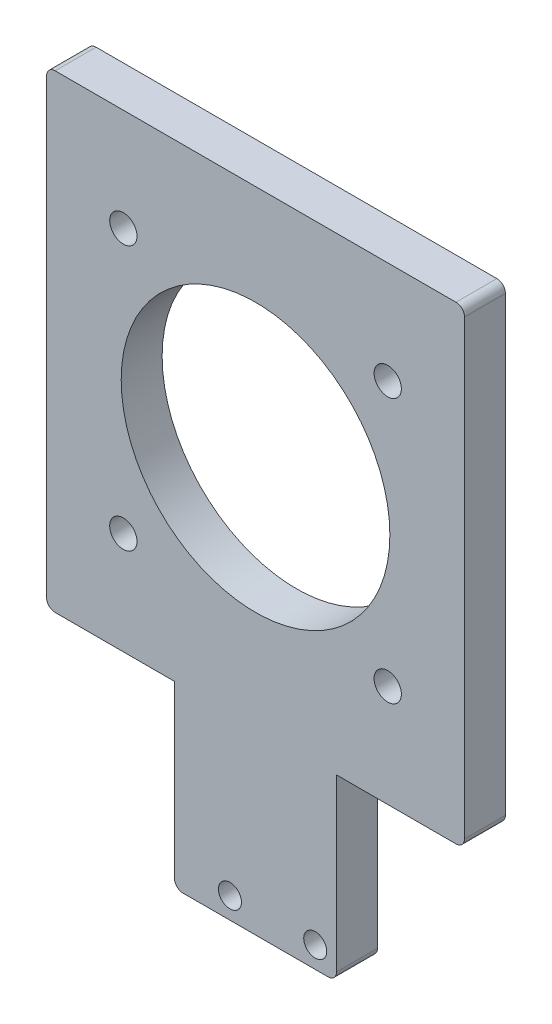
ISO-10303-21;
HEADER;
FILE_DESCRIPTION(('STEP AP214'),'2;1');
FILE_NAME('part.step','',(''),(''),'','','');
FILE_SCHEMA(('AUTOMOTIVE_DESIGN { 1 0 10303 214 1 1 1 1 }'));
ENDSEC;
DATA;
#1=APPLICATION_CONTEXT('core data for automotive mechanical design processes');
#2=APPLICATION_PROTOCOL_DEFINITION('international standard','automotive_design',2000,#1);
#3=PRODUCT_CONTEXT('',#1,'mechanical');
#4=PRODUCT('Part','Part','',(#3));
#5=PRODUCT_RELATED_PRODUCT_CATEGORY('part','',(#4));
#6=PRODUCT_DEFINITION_FORMATION('','',#4);
#7=PRODUCT_DEFINITION_CONTEXT('part definition',#1,'design');
#8=PRODUCT_DEFINITION('design','',#6,#7);
#9=PRODUCT_DEFINITION_SHAPE('','',#8);
#10=(LENGTH_UNIT() NAMED_UNIT(*) SI_UNIT(.MILLI.,.METRE.));
#11=(NAMED_UNIT(*) PLANE_ANGLE_UNIT() SI_UNIT($,.RADIAN.));
#12=(NAMED_UNIT(*) SI_UNIT($,.STERADIAN.) SOLID_ANGLE_UNIT());
#13=UNCERTAINTY_MEASURE_WITH_UNIT(LENGTH_MEASURE(1.E-05),#10,'distance_accuracy_value','');
#14=(GEOMETRIC_REPRESENTATION_CONTEXT(3) GLOBAL_UNCERTAINTY_ASSIGNED_CONTEXT((#13)) GLOBAL_UNIT_ASSIGNED_CONTEXT((#10,
#11,#12)) REPRESENTATION_CONTEXT('',''));
#15=CARTESIAN_POINT('',(0.,0.,0.));
#16=DIRECTION('',(0.,0.,1.));
#17=DIRECTION('',(1.,0.,0.));
#18=AXIS2_PLACEMENT_3D('',#15,#16,#17);
#19=CARTESIAN_POINT('',(13.0004011997071,3.65021960902744,4.8));
#20=DIRECTION('',(0.,0.,-1.));
#21=DIRECTION('',(-1.,0.,0.));
#22=AXIS2_PLACEMENT_3D('',#19,#20,#21);
#23=CYLINDRICAL_SURFACE('',#22,1.);
#24=CARTESIAN_POINT('',(13.0004011997071,3.65021960902744,0.));
#25=DIRECTION('',(0.,0.,-1.));
#26=DIRECTION('',(-1.,0.,0.));
#27=AXIS2_PLACEMENT_3D('',#24,#25,#26);
#28=CIRCLE('',#27,1.);
#29=CARTESIAN_POINT('',(13.0004011997071,2.65021960902744,0.));
#30=VERTEX_POINT('',#29);
#31=CARTESIAN_POINT('',(12.0004011997071,3.65021960902744,0.));
#32=VERTEX_POINT('',#31);
#33=EDGE_CURVE('E165',#30,#32,#28,.T.);
#34=ORIENTED_EDGE('',*,*,#33,.F.);
#35=DIRECTION('',(0.,0.,-1.));
#36=VECTOR('',#35,1.);
#37=CARTESIAN_POINT('',(13.0004011997071,2.65021960902744,4.8));
#38=LINE('',#37,#36);
#39=CARTESIAN_POINT('',(13.0004011997071,2.65021960902744,4.8));
#40=VERTEX_POINT('',#39);
#41=EDGE_CURVE('E11',#40,#30,#38,.T.);
#42=ORIENTED_EDGE('',*,*,#41,.F.);
#43=CARTESIAN_POINT('',(13.0004011997071,3.65021960902744,4.8));
#44=DIRECTION('',(0.,0.,-1.));
#45=DIRECTION('',(-1.,0.,0.));
#46=AXIS2_PLACEMENT_3D('',#43,#44,#45);
#47=CIRCLE('',#46,1.);
#48=CARTESIAN_POINT('',(12.0004011997071,3.65021960902744,4.8));
#49=VERTEX_POINT('',#48);
#50=EDGE_CURVE('E204',#40,#49,#47,.T.);
#51=ORIENTED_EDGE('',*,*,#50,.T.);
#52=DIRECTION('',(0.,0.,-1.));
#53=VECTOR('',#52,1.);
#54=CARTESIAN_POINT('',(12.0004011997071,3.65021960902744,4.8));
#55=LINE('',#54,#53);
#56=EDGE_CURVE('E35',#49,#32,#55,.T.);
#57=ORIENTED_EDGE('',*,*,#56,.T.);
#58=EDGE_LOOP('',(#34,#42,#51,#57));
#59=FACE_BOUND('',#58,.T.);
#60=ADVANCED_FACE('F32',(#59),#23,.T.);
#61=CARTESIAN_POINT('',(27.0004011997071,2.65021960902744,4.8));
#62=DIRECTION('',(0.,-1.,0.));
#63=DIRECTION('',(0.,0.,-1.));
#64=AXIS2_PLACEMENT_3D('',#61,#62,#63);
#65=PLANE('',#64);
#66=DIRECTION('',(-1.,0.,0.));
#67=VECTOR('',#66,1.);
#68=CARTESIAN_POINT('',(27.0004011997071,2.65021960902744,0.));
#69=LINE('',#68,#67);
#70=CARTESIAN_POINT('',(27.0004011997071,2.65021960902744,0.));
#71=VERTEX_POINT('',#70);
#72=EDGE_CURVE('E202',#71,#30,#69,.T.);
#73=ORIENTED_EDGE('',*,*,#72,.F.);
#74=DIRECTION('',(0.,0.,-1.));
#75=VECTOR('',#74,1.);
#76=CARTESIAN_POINT('',(27.0004011997071,2.65021960902744,4.8));
#77=LINE('',#76,#75);
#78=CARTESIAN_POINT('',(27.0004011997071,2.65021960902744,4.8));
#79=VERTEX_POINT('',#78);
#80=EDGE_CURVE('E41',#79,#71,#77,.T.);
#81=ORIENTED_EDGE('',*,*,#80,.F.);
#82=DIRECTION('',(-1.,0.,0.));
#83=VECTOR('',#82,1.);
#84=CARTESIAN_POINT('',(27.0004011997071,2.65021960902744,4.8));
#85=LINE('',#84,#83);
#86=EDGE_CURVE('E155',#79,#40,#85,.T.);
#87=ORIENTED_EDGE('',*,*,#86,.T.);
#88=ORIENTED_EDGE('',*,*,#41,.T.);
#89=EDGE_LOOP('',(#73,#81,#87,#88));
#90=FACE_BOUND('',#89,.T.);
#91=ADVANCED_FACE('F228',(#90),#65,.T.);
#92=CARTESIAN_POINT('',(27.0004011997071,-17.3497803909726,4.8));
#93=DIRECTION('',(-1.,0.,0.));
#94=DIRECTION('',(0.,-1.,0.));
#95=AXIS2_PLACEMENT_3D('',#92,#93,#94);
#96=PLANE('',#95);
#97=DIRECTION('',(0.,1.,0.));
#98=VECTOR('',#97,1.);
#99=CARTESIAN_POINT('',(27.0004011997071,-17.3497803909726,0.));
#100=LINE('',#99,#98);
#101=CARTESIAN_POINT('',(27.0004011997071,-17.3497803909726,0.));
#102=VERTEX_POINT('',#101);
#103=EDGE_CURVE('E142',#102,#71,#100,.T.);
#104=ORIENTED_EDGE('',*,*,#103,.F.);
#105=DIRECTION('',(0.,0.,-1.));
#106=VECTOR('',#105,1.);
#107=CARTESIAN_POINT('',(27.0004011997071,-17.3497803909726,4.8));
#108=LINE('',#107,#106);
#109=CARTESIAN_POINT('',(27.0004011997071,-17.3497803909726,4.8));
#110=VERTEX_POINT('',#109);
#111=EDGE_CURVE('E137',#110,#102,#108,.T.);
#112=ORIENTED_EDGE('',*,*,#111,.F.);
#113=DIRECTION('',(0.,1.,0.));
#114=VECTOR('',#113,1.);
#115=CARTESIAN_POINT('',(27.0004011997071,-17.3497803909726,4.8));
#116=LINE('',#115,#114);
#117=EDGE_CURVE('E140',#110,#79,#116,.T.);
#118=ORIENTED_EDGE('',*,*,#117,.T.);
#119=ORIENTED_EDGE('',*,*,#80,.T.);
#120=EDGE_LOOP('',(#104,#112,#118,#119));
#121=FACE_BOUND('',#120,.T.);
#122=ADVANCED_FACE('F139',(#121),#96,.T.);
#123=CARTESIAN_POINT('',(28.0004011997071,-17.3497803909726,4.8));
#124=DIRECTION('',(0.,0.,-1.));
#125=DIRECTION('',(-1.,0.,0.));
#126=AXIS2_PLACEMENT_3D('',#123,#124,#125);
#127=CYLINDRICAL_SURFACE('',#126,1.);
#128=CARTESIAN_POINT('',(28.0004011997071,-17.3497803909726,0.));
#129=DIRECTION('',(0.,0.,-1.));
#130=DIRECTION('',(-1.,0.,0.));
#131=AXIS2_PLACEMENT_3D('',#128,#129,#130);
#132=CIRCLE('',#131,1.);
#133=CARTESIAN_POINT('',(28.0004011997071,-18.3497803909726,0.));
#134=VERTEX_POINT('',#133);
#135=EDGE_CURVE('E199',#134,#102,#132,.T.);
#136=ORIENTED_EDGE('',*,*,#135,.F.);
#137=DIRECTION('',(0.,0.,-1.));
#138=VECTOR('',#137,1.);
#139=CARTESIAN_POINT('',(28.0004011997071,-18.3497803909726,4.8));
#140=LINE('',#139,#138);
#141=CARTESIAN_POINT('',(28.0004011997071,-18.3497803909726,4.8));
#142=VERTEX_POINT('',#141);
#143=EDGE_CURVE('E147',#142,#134,#140,.T.);
#144=ORIENTED_EDGE('',*,*,#143,.F.);
#145=CARTESIAN_POINT('',(28.0004011997071,-17.3497803909726,4.8));
#146=DIRECTION('',(0.,0.,-1.));
#147=DIRECTION('',(-1.,0.,0.));
#148=AXIS2_PLACEMENT_3D('',#145,#146,#147);
#149=CIRCLE('',#148,1.);
#150=EDGE_CURVE('E153',#142,#110,#149,.T.);
#151=ORIENTED_EDGE('',*,*,#150,.T.);
#152=ORIENTED_EDGE('',*,*,#111,.T.);
#153=EDGE_LOOP('',(#136,#144,#151,#152));
#154=FACE_BOUND('',#153,.T.);
#155=ADVANCED_FACE('F157',(#154),#127,.T.);
#156=CARTESIAN_POINT('',(45.0004011997071,-18.3497803909726,4.8));
#157=DIRECTION('',(0.,-1.,0.));
#158=DIRECTION('',(1.,0.,0.));
#159=AXIS2_PLACEMENT_3D('',#156,#157,#158);
#160=PLANE('',#159);
#161=DIRECTION('',(-1.,0.,0.));
#162=VECTOR('',#161,1.);
#163=CARTESIAN_POINT('',(45.0004011997071,-18.3497803909726,0.));
#164=LINE('',#163,#162);
#165=CARTESIAN_POINT('',(45.0004011997071,-18.3497803909726,0.));
#166=VERTEX_POINT('',#165);
#167=EDGE_CURVE('E196',#166,#134,#164,.T.);
#168=ORIENTED_EDGE('',*,*,#167,.F.);
#169=DIRECTION('',(0.,0.,-1.));
#170=VECTOR('',#169,1.);
#171=CARTESIAN_POINT('',(45.0004011997071,-18.3497803909726,4.8));
#172=LINE('',#171,#170);
#173=CARTESIAN_POINT('',(45.0004011997071,-18.3497803909726,4.8));
#174=VERTEX_POINT('',#173);
#175=EDGE_CURVE('E208',#174,#166,#172,.T.);
#176=ORIENTED_EDGE('',*,*,#175,.F.);
#177=DIRECTION('',(-1.,0.,0.));
#178=VECTOR('',#177,1.);
#179=CARTESIAN_POINT('',(45.0004011997071,-18.3497803909726,4.8));
#180=LINE('',#179,#178);
#181=EDGE_CURVE('E158',#174,#142,#180,.T.);
#182=ORIENTED_EDGE('',*,*,#181,.T.);
#183=ORIENTED_EDGE('',*,*,#143,.T.);
#184=EDGE_LOOP('',(#168,#176,#182,#183));
#185=FACE_BOUND('',#184,.T.);
#186=ADVANCED_FACE('F241',(#185),#160,.T.);
#187=CARTESIAN_POINT('',(45.0004011997071,-17.3497803909726,4.8));
#188=DIRECTION('',(0.,0.,-1.));
#189=DIRECTION('',(-1.,0.,0.));
#190=AXIS2_PLACEMENT_3D('',#187,#188,#189);
#191=CYLINDRICAL_SURFACE('',#190,0.999999999999999);
#192=CARTESIAN_POINT('',(45.0004011997071,-17.3497803909726,0.));
#193=DIRECTION('',(0.,0.,-1.));
#194=DIRECTION('',(-1.,0.,0.));
#195=AXIS2_PLACEMENT_3D('',#192,#193,#194);
#196=CIRCLE('',#195,0.999999999999999);
#197=CARTESIAN_POINT('',(46.0004011997071,-17.3497803909726,0.));
#198=VERTEX_POINT('',#197);
#199=EDGE_CURVE('E193',#198,#166,#196,.T.);
#200=ORIENTED_EDGE('',*,*,#199,.F.);
#201=DIRECTION('',(0.,0.,-1.));
#202=VECTOR('',#201,1.);
#203=CARTESIAN_POINT('',(46.0004011997071,-17.3497803909726,4.8));
#204=LINE('',#203,#202);
#205=CARTESIAN_POINT('',(46.0004011997071,-17.3497803909726,4.8));
#206=VERTEX_POINT('',#205);
#207=EDGE_CURVE('E210',#206,#198,#204,.T.);
#208=ORIENTED_EDGE('',*,*,#207,.F.);
#209=CARTESIAN_POINT('',(45.0004011997071,-17.3497803909726,4.8));
#210=DIRECTION('',(0.,0.,-1.));
#211=DIRECTION('',(-1.,0.,0.));
#212=AXIS2_PLACEMENT_3D('',#209,#210,#211);
#213=CIRCLE('',#212,0.999999999999999);
#214=EDGE_CURVE('E160',#206,#174,#213,.T.);
#215=ORIENTED_EDGE('',*,*,#214,.T.);
#216=ORIENTED_EDGE('',*,*,#175,.T.);
#217=EDGE_LOOP('',(#200,#208,#215,#216));
#218=FACE_BOUND('',#217,.T.);
#219=ADVANCED_FACE('F244',(#218),#191,.T.);
#220=CARTESIAN_POINT('',(46.0004011997071,2.65021960902744,4.8));
#221=DIRECTION('',(1.,0.,0.));
#222=DIRECTION('',(0.,1.,0.));
#223=AXIS2_PLACEMENT_3D('',#220,#221,#222);
#224=PLANE('',#223);
#225=DIRECTION('',(0.,-1.,0.));
#226=VECTOR('',#225,1.);
#227=CARTESIAN_POINT('',(46.0004011997071,2.65021960902744,0.));
#228=LINE('',#227,#226);
#229=CARTESIAN_POINT('',(46.0004011997071,2.65021960902744,0.));
#230=VERTEX_POINT('',#229);
#231=EDGE_CURVE('E190',#230,#198,#228,.T.);
#232=ORIENTED_EDGE('',*,*,#231,.F.);
#233=DIRECTION('',(0.,0.,-1.));
#234=VECTOR('',#233,1.);
#235=CARTESIAN_POINT('',(46.0004011997071,2.65021960902744,4.8));
#236=LINE('',#235,#234);
#237=CARTESIAN_POINT('',(46.0004011997071,2.65021960902744,4.8));
#238=VERTEX_POINT('',#237);
#239=EDGE_CURVE('E212',#238,#230,#236,.T.);
#240=ORIENTED_EDGE('',*,*,#239,.F.);
#241=DIRECTION('',(0.,-1.,0.));
#242=VECTOR('',#241,1.);
#243=CARTESIAN_POINT('',(46.0004011997071,2.65021960902744,4.8));
#244=LINE('',#243,#242);
#245=EDGE_CURVE('E382',#238,#206,#244,.T.);
#246=ORIENTED_EDGE('',*,*,#245,.T.);
#247=ORIENTED_EDGE('',*,*,#207,.T.);
#248=EDGE_LOOP('',(#232,#240,#246,#247));
#249=FACE_BOUND('',#248,.T.);
#250=ADVANCED_FACE('F248',(#249),#224,.T.);
#251=CARTESIAN_POINT('',(60.0004011997071,2.65021960902744,4.8));
#252=DIRECTION('',(0.,-1.,0.));
#253=DIRECTION('',(0.,0.,-1.));
#254=AXIS2_PLACEMENT_3D('',#251,#252,#253);
#255=PLANE('',#254);
#256=DIRECTION('',(-1.,0.,0.));
#257=VECTOR('',#256,1.);
#258=CARTESIAN_POINT('',(60.0004011997071,2.65021960902744,0.));
#259=LINE('',#258,#257);
#260=CARTESIAN_POINT('',(60.0004011997071,2.65021960902743,0.));
#261=VERTEX_POINT('',#260);
#262=EDGE_CURVE('E187',#261,#230,#259,.T.);
#263=ORIENTED_EDGE('',*,*,#262,.F.);
#264=DIRECTION('',(0.,0.,-1.));
#265=VECTOR('',#264,1.);
#266=CARTESIAN_POINT('',(60.0004011997071,2.65021960902743,4.8));
#267=LINE('',#266,#265);
#268=CARTESIAN_POINT('',(60.0004011997071,2.65021960902743,4.8));
#269=VERTEX_POINT('',#268);
#270=EDGE_CURVE('E214',#269,#261,#267,.T.);
#271=ORIENTED_EDGE('',*,*,#270,.F.);
#272=DIRECTION('',(-1.,0.,0.));
#273=VECTOR('',#272,1.);
#274=CARTESIAN_POINT('',(60.0004011997071,2.65021960902744,4.8));
#275=LINE('',#274,#273);
#276=EDGE_CURVE('E379',#269,#238,#275,.T.);
#277=ORIENTED_EDGE('',*,*,#276,.T.);
#278=ORIENTED_EDGE('',*,*,#239,.T.);
#279=EDGE_LOOP('',(#263,#271,#277,#278));
#280=FACE_BOUND('',#279,.T.);
#281=ADVANCED_FACE('F252',(#280),#255,.T.);
#282=CARTESIAN_POINT('',(60.0004011997071,3.65021960902744,4.8));
#283=DIRECTION('',(0.,0.,-1.));
#284=DIRECTION('',(-1.,0.,0.));
#285=AXIS2_PLACEMENT_3D('',#282,#283,#284);
#286=CYLINDRICAL_SURFACE('',#285,1.);
#287=CARTESIAN_POINT('',(60.0004011997071,3.65021960902744,0.));
#288=DIRECTION('',(0.,0.,-1.));
#289=DIRECTION('',(-1.,0.,0.));
#290=AXIS2_PLACEMENT_3D('',#287,#288,#289);
#291=CIRCLE('',#290,1.);
#292=CARTESIAN_POINT('',(61.0004011997071,3.65021960902744,0.));
#293=VERTEX_POINT('',#292);
#294=EDGE_CURVE('E184',#293,#261,#291,.T.);
#295=ORIENTED_EDGE('',*,*,#294,.F.);
#296=DIRECTION('',(0.,0.,-1.));
#297=VECTOR('',#296,1.);
#298=CARTESIAN_POINT('',(61.0004011997071,3.65021960902744,4.8));
#299=LINE('',#298,#297);
#300=CARTESIAN_POINT('',(61.0004011997071,3.65021960902744,4.8));
#301=VERTEX_POINT('',#300);
#302=EDGE_CURVE('E216',#301,#293,#299,.T.);
#303=ORIENTED_EDGE('',*,*,#302,.F.);
#304=CARTESIAN_POINT('',(60.0004011997071,3.65021960902744,4.8));
#305=DIRECTION('',(0.,0.,-1.));
#306=DIRECTION('',(-1.,0.,0.));
#307=AXIS2_PLACEMENT_3D('',#304,#305,#306);
#308=CIRCLE('',#307,1.);
#309=EDGE_CURVE('E376',#301,#269,#308,.T.);
#310=ORIENTED_EDGE('',*,*,#309,.T.);
#311=ORIENTED_EDGE('',*,*,#270,.T.);
#312=EDGE_LOOP('',(#295,#303,#310,#311));
#313=FACE_BOUND('',#312,.T.);
#314=ADVANCED_FACE('F256',(#313),#286,.T.);
#315=CARTESIAN_POINT('',(61.0004011997071,56.6502196090274,4.8));
#316=DIRECTION('',(1.,0.,0.));
#317=DIRECTION('',(0.,1.,0.));
#318=AXIS2_PLACEMENT_3D('',#315,#316,#317);
#319=PLANE('',#318);
#320=DIRECTION('',(0.,-1.,0.));
#321=VECTOR('',#320,1.);
#322=CARTESIAN_POINT('',(61.0004011997071,56.6502196090274,0.));
#323=LINE('',#322,#321);
#324=CARTESIAN_POINT('',(61.0004011997071,56.6502196090274,0.));
#325=VERTEX_POINT('',#324);
#326=EDGE_CURVE('E181',#325,#293,#323,.T.);
#327=ORIENTED_EDGE('',*,*,#326,.F.);
#328=DIRECTION('',(0.,0.,-1.));
#329=VECTOR('',#328,1.);
#330=CARTESIAN_POINT('',(61.0004011997071,56.6502196090274,4.8));
#331=LINE('',#330,#329);
#332=CARTESIAN_POINT('',(61.0004011997071,56.6502196090274,4.8));
#333=VERTEX_POINT('',#332);
#334=EDGE_CURVE('E218',#333,#325,#331,.T.);
#335=ORIENTED_EDGE('',*,*,#334,.F.);
#336=DIRECTION('',(0.,-1.,0.));
#337=VECTOR('',#336,1.);
#338=CARTESIAN_POINT('',(61.0004011997071,56.6502196090274,4.8));
#339=LINE('',#338,#337);
#340=EDGE_CURVE('E373',#333,#301,#339,.T.);
#341=ORIENTED_EDGE('',*,*,#340,.T.);
#342=ORIENTED_EDGE('',*,*,#302,.T.);
#343=EDGE_LOOP('',(#327,#335,#341,#342));
#344=FACE_BOUND('',#343,.T.);
#345=ADVANCED_FACE('F260',(#344),#319,.T.);
#346=CARTESIAN_POINT('',(60.0004011997071,56.6502196090274,4.8));
#347=DIRECTION('',(0.,0.,-1.));
#348=DIRECTION('',(-1.,0.,0.));
#349=AXIS2_PLACEMENT_3D('',#346,#347,#348);
#350=CYLINDRICAL_SURFACE('',#349,1.);
#351=CARTESIAN_POINT('',(60.0004011997071,56.6502196090274,0.));
#352=DIRECTION('',(0.,0.,-1.));
#353=DIRECTION('',(1.,0.,0.));
#354=AXIS2_PLACEMENT_3D('',#351,#352,#353);
#355=CIRCLE('',#354,1.);
#356=CARTESIAN_POINT('',(60.0004011997071,57.6502196090274,0.));
#357=VERTEX_POINT('',#356);
#358=EDGE_CURVE('E178',#357,#325,#355,.T.);
#359=ORIENTED_EDGE('',*,*,#358,.F.);
#360=DIRECTION('',(0.,0.,-1.));
#361=VECTOR('',#360,1.);
#362=CARTESIAN_POINT('',(60.0004011997071,57.6502196090274,4.8));
#363=LINE('',#362,#361);
#364=CARTESIAN_POINT('',(60.0004011997071,57.6502196090274,4.8));
#365=VERTEX_POINT('',#364);
#366=EDGE_CURVE('E220',#365,#357,#363,.T.);
#367=ORIENTED_EDGE('',*,*,#366,.F.);
#368=CARTESIAN_POINT('',(60.0004011997071,56.6502196090274,4.8));
#369=DIRECTION('',(0.,0.,-1.));
#370=DIRECTION('',(1.,0.,0.));
#371=AXIS2_PLACEMENT_3D('',#368,#369,#370);
#372=CIRCLE('',#371,1.);
#373=EDGE_CURVE('E370',#365,#333,#372,.T.);
#374=ORIENTED_EDGE('',*,*,#373,.T.);
#375=ORIENTED_EDGE('',*,*,#334,.T.);
#376=EDGE_LOOP('',(#359,#367,#374,#375));
#377=FACE_BOUND('',#376,.T.);
#378=ADVANCED_FACE('F264',(#377),#350,.T.);
#379=CARTESIAN_POINT('',(13.0004011997071,57.6502196090274,4.8));
#380=DIRECTION('',(0.,1.,0.));
#381=DIRECTION('',(-1.,0.,0.));
#382=AXIS2_PLACEMENT_3D('',#379,#380,#381);
#383=PLANE('',#382);
#384=DIRECTION('',(1.,0.,0.));
#385=VECTOR('',#384,1.);
#386=CARTESIAN_POINT('',(13.0004011997071,57.6502196090274,0.));
#387=LINE('',#386,#385);
#388=CARTESIAN_POINT('',(13.0004011997071,57.6502196090274,0.));
#389=VERTEX_POINT('',#388);
#390=EDGE_CURVE('E175',#389,#357,#387,.T.);
#391=ORIENTED_EDGE('',*,*,#390,.F.);
#392=DIRECTION('',(0.,0.,-1.));
#393=VECTOR('',#392,1.);
#394=CARTESIAN_POINT('',(13.0004011997071,57.6502196090274,4.8));
#395=LINE('',#394,#393);
#396=CARTESIAN_POINT('',(13.0004011997071,57.6502196090274,4.8));
#397=VERTEX_POINT('',#396);
#398=EDGE_CURVE('E222',#397,#389,#395,.T.);
#399=ORIENTED_EDGE('',*,*,#398,.F.);
#400=DIRECTION('',(1.,0.,0.));
#401=VECTOR('',#400,1.);
#402=CARTESIAN_POINT('',(13.0004011997071,57.6502196090274,4.8));
#403=LINE('',#402,#401);
#404=EDGE_CURVE('E367',#397,#365,#403,.T.);
#405=ORIENTED_EDGE('',*,*,#404,.T.);
#406=ORIENTED_EDGE('',*,*,#366,.T.);
#407=EDGE_LOOP('',(#391,#399,#405,#406));
#408=FACE_BOUND('',#407,.T.);
#409=ADVANCED_FACE('F268',(#408),#383,.T.);
#410=CARTESIAN_POINT('',(13.0004011997071,56.6502196090274,4.8));
#411=DIRECTION('',(0.,0.,-1.));
#412=DIRECTION('',(-1.,0.,0.));
#413=AXIS2_PLACEMENT_3D('',#410,#411,#412);
#414=CYLINDRICAL_SURFACE('',#413,0.999999999999997);
#415=CARTESIAN_POINT('',(13.0004011997071,56.6502196090274,0.));
#416=DIRECTION('',(0.,0.,-1.));
#417=DIRECTION('',(1.,0.,0.));
#418=AXIS2_PLACEMENT_3D('',#415,#416,#417);
#419=CIRCLE('',#418,0.999999999999997);
#420=CARTESIAN_POINT('',(12.0004011997071,56.6502196090274,0.));
#421=VERTEX_POINT('',#420);
#422=EDGE_CURVE('E172',#421,#389,#419,.T.);
#423=ORIENTED_EDGE('',*,*,#422,.F.);
#424=DIRECTION('',(0.,0.,-1.));
#425=VECTOR('',#424,1.);
#426=CARTESIAN_POINT('',(12.0004011997071,56.6502196090274,4.8));
#427=LINE('',#426,#425);
#428=CARTESIAN_POINT('',(12.0004011997071,56.6502196090274,4.8));
#429=VERTEX_POINT('',#428);
#430=EDGE_CURVE('E223',#429,#421,#427,.T.);
#431=ORIENTED_EDGE('',*,*,#430,.F.);
#432=CARTESIAN_POINT('',(13.0004011997071,56.6502196090274,4.8));
#433=DIRECTION('',(0.,0.,-1.));
#434=DIRECTION('',(1.,0.,0.));
#435=AXIS2_PLACEMENT_3D('',#432,#433,#434);
#436=CIRCLE('',#435,0.999999999999997);
#437=EDGE_CURVE('E364',#429,#397,#436,.T.);
#438=ORIENTED_EDGE('',*,*,#437,.T.);
#439=ORIENTED_EDGE('',*,*,#398,.T.);
#440=EDGE_LOOP('',(#423,#431,#438,#439));
#441=FACE_BOUND('',#440,.T.);
#442=ADVANCED_FACE('F272',(#441),#414,.T.);
#443=CARTESIAN_POINT('',(12.0004011997071,3.65021960902744,4.8));
#444=DIRECTION('',(-1.,0.,0.));
#445=DIRECTION('',(0.,0.,1.));
#446=AXIS2_PLACEMENT_3D('',#443,#444,#445);
#447=PLANE('',#446);
#448=DIRECTION('',(0.,1.,0.));
#449=VECTOR('',#448,1.);
#450=CARTESIAN_POINT('',(12.0004011997071,3.65021960902744,0.));
#451=LINE('',#450,#449);
#452=EDGE_CURVE('E168',#32,#421,#451,.T.);
#453=ORIENTED_EDGE('',*,*,#452,.F.);
#454=ORIENTED_EDGE('',*,*,#56,.F.);
#455=DIRECTION('',(0.,1.,0.));
#456=VECTOR('',#455,1.);
#457=CARTESIAN_POINT('',(12.0004011997071,3.65021960902744,4.8));
#458=LINE('',#457,#456);
#459=EDGE_CURVE('E362',#49,#429,#458,.T.);
#460=ORIENTED_EDGE('',*,*,#459,.T.);
#461=ORIENTED_EDGE('',*,*,#430,.T.);
#462=EDGE_LOOP('',(#453,#454,#460,#461));
#463=FACE_BOUND('',#462,.T.);
#464=ADVANCED_FACE('F225',(#463),#447,.T.);
#465=CARTESIAN_POINT('',(13.0004011997071,3.65021960902744,4.8));
#466=DIRECTION('',(0.,0.,-1.));
#467=DIRECTION('',(-1.,0.,0.));
#468=AXIS2_PLACEMENT_3D('',#465,#466,#467);
#469=PLANE('',#468);
#470=CARTESIAN_POINT('',(36.5004011997071,30.1502196090274,4.8));
#471=DIRECTION('',(0.,0.,-1.));
#472=DIRECTION('',(-1.,0.,0.));
#473=AXIS2_PLACEMENT_3D('',#470,#471,#472);
#474=CIRCLE('',#473,15.75);
#475=CARTESIAN_POINT('',(20.7504011997071,30.1502196090274,4.8));
#476=VERTEX_POINT('',#475);
#477=EDGE_CURVE('E319',#476,#476,#474,.T.);
#478=ORIENTED_EDGE('',*,*,#477,.T.);
#479=EDGE_LOOP('',(#478));
#480=FACE_BOUND('',#479,.T.);
#481=CARTESIAN_POINT('',(21.0004011997071,14.6502196090274,4.8));
#482=DIRECTION('',(0.,0.,-1.));
#483=DIRECTION('',(-1.,0.,0.));
#484=AXIS2_PLACEMENT_3D('',#481,#482,#483);
#485=CIRCLE('',#484,1.60000000000001);
#486=CARTESIAN_POINT('',(19.4004011997071,14.6502196090274,4.8));
#487=VERTEX_POINT('',#486);
#488=EDGE_CURVE('E327',#487,#487,#485,.T.);
#489=ORIENTED_EDGE('',*,*,#488,.T.);
#490=EDGE_LOOP('',(#489));
#491=FACE_BOUND('',#490,.T.);
#492=CARTESIAN_POINT('',(52.0004442333903,45.6502196090274,4.8));
#493=DIRECTION('',(0.,0.,-1.));
#494=DIRECTION('',(-1.,0.,0.));
#495=AXIS2_PLACEMENT_3D('',#492,#493,#494);
#496=CIRCLE('',#495,1.6);
#497=CARTESIAN_POINT('',(50.4004442333903,45.6502196090274,4.8));
#498=VERTEX_POINT('',#497);
#499=EDGE_CURVE('E333',#498,#498,#496,.T.);
#500=ORIENTED_EDGE('',*,*,#499,.T.);
#501=EDGE_LOOP('',(#500));
#502=FACE_BOUND('',#501,.T.);
#503=CARTESIAN_POINT('',(52.0004011997071,14.6502196090274,4.8));
#504=DIRECTION('',(0.,0.,-1.));
#505=DIRECTION('',(-1.,0.,0.));
#506=AXIS2_PLACEMENT_3D('',#503,#504,#505);
#507=CIRCLE('',#506,1.6);
#508=CARTESIAN_POINT('',(50.4004011997071,14.6502196090274,4.8));
#509=VERTEX_POINT('',#508);
#510=EDGE_CURVE('E339',#509,#509,#507,.T.);
#511=ORIENTED_EDGE('',*,*,#510,.T.);
#512=EDGE_LOOP('',(#511));
#513=FACE_BOUND('',#512,.T.);
#514=CARTESIAN_POINT('',(21.0004011997071,45.6502196090274,4.8));
#515=DIRECTION('',(0.,0.,-1.));
#516=DIRECTION('',(-1.,0.,0.));
#517=AXIS2_PLACEMENT_3D('',#514,#515,#516);
#518=CIRCLE('',#517,1.60000000000001);
#519=CARTESIAN_POINT('',(19.4004011997071,45.6502196090274,4.8));
#520=VERTEX_POINT('',#519);
#521=EDGE_CURVE('E345',#520,#520,#518,.T.);
#522=ORIENTED_EDGE('',*,*,#521,.T.);
#523=EDGE_LOOP('',(#522));
#524=FACE_BOUND('',#523,.T.);
#525=CARTESIAN_POINT('',(33.5004011997071,-15.8497803909726,4.8));
#526=DIRECTION('',(0.,0.,-1.));
#527=DIRECTION('',(-1.,0.,0.));
#528=AXIS2_PLACEMENT_3D('',#525,#526,#527);
#529=CIRCLE('',#528,1.35);
#530=CARTESIAN_POINT('',(32.1504011997071,-15.8497803909726,4.8));
#531=VERTEX_POINT('',#530);
#532=EDGE_CURVE('E351',#531,#531,#529,.T.);
#533=ORIENTED_EDGE('',*,*,#532,.T.);
#534=EDGE_LOOP('',(#533));
#535=FACE_BOUND('',#534,.T.);
#536=CARTESIAN_POINT('',(43.5004011997071,-15.8497803909726,4.8));
#537=DIRECTION('',(0.,0.,-1.));
#538=DIRECTION('',(-1.,0.,0.));
#539=AXIS2_PLACEMENT_3D('',#536,#537,#538);
#540=CIRCLE('',#539,1.35);
#541=CARTESIAN_POINT('',(42.1504011997071,-15.8497803909726,4.8));
#542=VERTEX_POINT('',#541);
#543=EDGE_CURVE('E169',#542,#542,#540,.T.);
#544=ORIENTED_EDGE('',*,*,#543,.T.);
#545=EDGE_LOOP('',(#544));
#546=FACE_BOUND('',#545,.T.);
#547=ORIENTED_EDGE('',*,*,#50,.F.);
#548=ORIENTED_EDGE('',*,*,#86,.F.);
#549=ORIENTED_EDGE('',*,*,#117,.F.);
#550=ORIENTED_EDGE('',*,*,#150,.F.);
#551=ORIENTED_EDGE('',*,*,#181,.F.);
#552=ORIENTED_EDGE('',*,*,#214,.F.);
#553=ORIENTED_EDGE('',*,*,#245,.F.);
#554=ORIENTED_EDGE('',*,*,#276,.F.);
#555=ORIENTED_EDGE('',*,*,#309,.F.);
#556=ORIENTED_EDGE('',*,*,#340,.F.);
#557=ORIENTED_EDGE('',*,*,#373,.F.);
#558=ORIENTED_EDGE('',*,*,#404,.F.);
#559=ORIENTED_EDGE('',*,*,#437,.F.);
#560=ORIENTED_EDGE('',*,*,#459,.F.);
#561=EDGE_LOOP('',(#547,#548,#549,#550,#551,#552,#553,#554,#555,#556,#557,#558,#559,#560));
#562=FACE_BOUND('',#561,.T.);
#563=ADVANCED_FACE('F151',(#480,#491,#502,#513,#524,#535,#546,#562),#469,.F.);
#564=CARTESIAN_POINT('',(13.0004011997071,3.65021960902744,0.));
#565=DIRECTION('',(0.,0.,-1.));
#566=DIRECTION('',(-1.,0.,0.));
#567=AXIS2_PLACEMENT_3D('',#564,#565,#566);
#568=PLANE('',#567);
#569=CARTESIAN_POINT('',(36.5004011997071,30.1502196090274,0.));
#570=DIRECTION('',(0.,0.,-1.));
#571=DIRECTION('',(-1.,0.,0.));
#572=AXIS2_PLACEMENT_3D('',#569,#570,#571);
#573=CIRCLE('',#572,15.75);
#574=CARTESIAN_POINT('',(20.7504011997071,30.1502196090274,0.));
#575=VERTEX_POINT('',#574);
#576=EDGE_CURVE('E322',#575,#575,#573,.T.);
#577=ORIENTED_EDGE('',*,*,#576,.F.);
#578=EDGE_LOOP('',(#577));
#579=FACE_BOUND('',#578,.T.);
#580=CARTESIAN_POINT('',(21.0004011997071,14.6502196090274,0.));
#581=DIRECTION('',(0.,0.,-1.));
#582=DIRECTION('',(-1.,0.,0.));
#583=AXIS2_PLACEMENT_3D('',#580,#581,#582);
#584=CIRCLE('',#583,1.60000000000001);
#585=CARTESIAN_POINT('',(19.4004011997071,14.6502196090274,0.));
#586=VERTEX_POINT('',#585);
#587=EDGE_CURVE('E324',#586,#586,#584,.T.);
#588=ORIENTED_EDGE('',*,*,#587,.F.);
#589=EDGE_LOOP('',(#588));
#590=FACE_BOUND('',#589,.T.);
#591=CARTESIAN_POINT('',(52.0004442333903,45.6502196090274,0.));
#592=DIRECTION('',(0.,0.,-1.));
#593=DIRECTION('',(-1.,0.,0.));
#594=AXIS2_PLACEMENT_3D('',#591,#592,#593);
#595=CIRCLE('',#594,1.6);
#596=CARTESIAN_POINT('',(50.4004442333903,45.6502196090274,0.));
#597=VERTEX_POINT('',#596);
#598=EDGE_CURVE('E330',#597,#597,#595,.T.);
#599=ORIENTED_EDGE('',*,*,#598,.F.);
#600=EDGE_LOOP('',(#599));
#601=FACE_BOUND('',#600,.T.);
#602=CARTESIAN_POINT('',(52.0004011997071,14.6502196090274,0.));
#603=DIRECTION('',(0.,0.,-1.));
#604=DIRECTION('',(-1.,0.,0.));
#605=AXIS2_PLACEMENT_3D('',#602,#603,#604);
#606=CIRCLE('',#605,1.6);
#607=CARTESIAN_POINT('',(50.4004011997071,14.6502196090274,0.));
#608=VERTEX_POINT('',#607);
#609=EDGE_CURVE('E336',#608,#608,#606,.T.);
#610=ORIENTED_EDGE('',*,*,#609,.F.);
#611=EDGE_LOOP('',(#610));
#612=FACE_BOUND('',#611,.T.);
#613=CARTESIAN_POINT('',(21.0004011997071,45.6502196090274,0.));
#614=DIRECTION('',(0.,0.,-1.));
#615=DIRECTION('',(-1.,0.,0.));
#616=AXIS2_PLACEMENT_3D('',#613,#614,#615);
#617=CIRCLE('',#616,1.60000000000001);
#618=CARTESIAN_POINT('',(19.4004011997071,45.6502196090274,0.));
#619=VERTEX_POINT('',#618);
#620=EDGE_CURVE('E342',#619,#619,#617,.T.);
#621=ORIENTED_EDGE('',*,*,#620,.F.);
#622=EDGE_LOOP('',(#621));
#623=FACE_BOUND('',#622,.T.);
#624=CARTESIAN_POINT('',(33.5004011997071,-15.8497803909726,0.));
#625=DIRECTION('',(0.,0.,-1.));
#626=DIRECTION('',(-1.,0.,0.));
#627=AXIS2_PLACEMENT_3D('',#624,#625,#626);
#628=CIRCLE('',#627,1.35);
#629=CARTESIAN_POINT('',(32.1504011997071,-15.8497803909726,0.));
#630=VERTEX_POINT('',#629);
#631=EDGE_CURVE('E348',#630,#630,#628,.T.);
#632=ORIENTED_EDGE('',*,*,#631,.F.);
#633=EDGE_LOOP('',(#632));
#634=FACE_BOUND('',#633,.T.);
#635=CARTESIAN_POINT('',(43.5004011997071,-15.8497803909726,0.));
#636=DIRECTION('',(0.,0.,-1.));
#637=DIRECTION('',(-1.,0.,0.));
#638=AXIS2_PLACEMENT_3D('',#635,#636,#637);
#639=CIRCLE('',#638,1.35);
#640=CARTESIAN_POINT('',(42.1504011997071,-15.8497803909726,0.));
#641=VERTEX_POINT('',#640);
#642=EDGE_CURVE('E354',#641,#641,#639,.T.);
#643=ORIENTED_EDGE('',*,*,#642,.F.);
#644=EDGE_LOOP('',(#643));
#645=FACE_BOUND('',#644,.T.);
#646=ORIENTED_EDGE('',*,*,#33,.T.);
#647=ORIENTED_EDGE('',*,*,#452,.T.);
#648=ORIENTED_EDGE('',*,*,#422,.T.);
#649=ORIENTED_EDGE('',*,*,#390,.T.);
#650=ORIENTED_EDGE('',*,*,#358,.T.);
#651=ORIENTED_EDGE('',*,*,#326,.T.);
#652=ORIENTED_EDGE('',*,*,#294,.T.);
#653=ORIENTED_EDGE('',*,*,#262,.T.);
#654=ORIENTED_EDGE('',*,*,#231,.T.);
#655=ORIENTED_EDGE('',*,*,#199,.T.);
#656=ORIENTED_EDGE('',*,*,#167,.T.);
#657=ORIENTED_EDGE('',*,*,#135,.T.);
#658=ORIENTED_EDGE('',*,*,#103,.T.);
#659=ORIENTED_EDGE('',*,*,#72,.T.);
#660=EDGE_LOOP('',(#646,#647,#648,#649,#650,#651,#652,#653,#654,#655,#656,#657,#658,#659));
#661=FACE_BOUND('',#660,.T.);
#662=ADVANCED_FACE('F227',(#579,#590,#601,#612,#623,#634,#645,#661),#568,.T.);
#663=CARTESIAN_POINT('',(43.5004011997071,-15.8497803909726,4.8));
#664=DIRECTION('',(0.,0.,-1.));
#665=DIRECTION('',(-1.,0.,0.));
#666=AXIS2_PLACEMENT_3D('',#663,#664,#665);
#667=CYLINDRICAL_SURFACE('',#666,1.35);
#668=ORIENTED_EDGE('',*,*,#543,.F.);
#669=EDGE_LOOP('',(#668));
#670=FACE_BOUND('',#669,.T.);
#671=ORIENTED_EDGE('',*,*,#642,.T.);
#672=EDGE_LOOP('',(#671));
#673=FACE_BOUND('',#672,.T.);
#674=ADVANCED_FACE('F284',(#670,#673),#667,.F.);
#675=CARTESIAN_POINT('',(33.5004011997071,-15.8497803909726,4.8));
#676=DIRECTION('',(0.,0.,-1.));
#677=DIRECTION('',(-1.,0.,0.));
#678=AXIS2_PLACEMENT_3D('',#675,#676,#677);
#679=CYLINDRICAL_SURFACE('',#678,1.35);
#680=ORIENTED_EDGE('',*,*,#532,.F.);
#681=EDGE_LOOP('',(#680));
#682=FACE_BOUND('',#681,.T.);
#683=ORIENTED_EDGE('',*,*,#631,.T.);
#684=EDGE_LOOP('',(#683));
#685=FACE_BOUND('',#684,.T.);
#686=ADVANCED_FACE('F291',(#682,#685),#679,.F.);
#687=CARTESIAN_POINT('',(21.0004011997071,45.6502196090274,4.8));
#688=DIRECTION('',(0.,0.,-1.));
#689=DIRECTION('',(-1.,0.,0.));
#690=AXIS2_PLACEMENT_3D('',#687,#688,#689);
#691=CYLINDRICAL_SURFACE('',#690,1.60000000000001);
#692=ORIENTED_EDGE('',*,*,#521,.F.);
#693=EDGE_LOOP('',(#692));
#694=FACE_BOUND('',#693,.T.);
#695=ORIENTED_EDGE('',*,*,#620,.T.);
#696=EDGE_LOOP('',(#695));
#697=FACE_BOUND('',#696,.T.);
#698=ADVANCED_FACE('F295',(#694,#697),#691,.F.);
#699=CARTESIAN_POINT('',(52.0004011997071,14.6502196090274,4.8));
#700=DIRECTION('',(0.,0.,-1.));
#701=DIRECTION('',(-1.,0.,0.));
#702=AXIS2_PLACEMENT_3D('',#699,#700,#701);
#703=CYLINDRICAL_SURFACE('',#702,1.6);
#704=ORIENTED_EDGE('',*,*,#510,.F.);
#705=EDGE_LOOP('',(#704));
#706=FACE_BOUND('',#705,.T.);
#707=ORIENTED_EDGE('',*,*,#609,.T.);
#708=EDGE_LOOP('',(#707));
#709=FACE_BOUND('',#708,.T.);
#710=ADVANCED_FACE('F299',(#706,#709),#703,.F.);
#711=CARTESIAN_POINT('',(52.0004442333903,45.6502196090274,4.8));
#712=DIRECTION('',(0.,0.,-1.));
#713=DIRECTION('',(-1.,0.,0.));
#714=AXIS2_PLACEMENT_3D('',#711,#712,#713);
#715=CYLINDRICAL_SURFACE('',#714,1.6);
#716=ORIENTED_EDGE('',*,*,#499,.F.);
#717=EDGE_LOOP('',(#716));
#718=FACE_BOUND('',#717,.T.);
#719=ORIENTED_EDGE('',*,*,#598,.T.);
#720=EDGE_LOOP('',(#719));
#721=FACE_BOUND('',#720,.T.);
#722=ADVANCED_FACE('F303',(#718,#721),#715,.F.);
#723=CARTESIAN_POINT('',(21.0004011997071,14.6502196090274,4.8));
#724=DIRECTION('',(0.,0.,-1.));
#725=DIRECTION('',(-1.,0.,0.));
#726=AXIS2_PLACEMENT_3D('',#723,#724,#725);
#727=CYLINDRICAL_SURFACE('',#726,1.60000000000001);
#728=ORIENTED_EDGE('',*,*,#488,.F.);
#729=EDGE_LOOP('',(#728));
#730=FACE_BOUND('',#729,.T.);
#731=ORIENTED_EDGE('',*,*,#587,.T.);
#732=EDGE_LOOP('',(#731));
#733=FACE_BOUND('',#732,.T.);
#734=ADVANCED_FACE('F307',(#730,#733),#727,.F.);
#735=CARTESIAN_POINT('',(36.5004011997071,30.1502196090274,4.8));
#736=DIRECTION('',(0.,0.,-1.));
#737=DIRECTION('',(-1.,0.,0.));
#738=AXIS2_PLACEMENT_3D('',#735,#736,#737);
#739=CYLINDRICAL_SURFACE('',#738,15.75);
#740=ORIENTED_EDGE('',*,*,#477,.F.);
#741=EDGE_LOOP('',(#740));
#742=FACE_BOUND('',#741,.T.);
#743=ORIENTED_EDGE('',*,*,#576,.T.);
#744=EDGE_LOOP('',(#743));
#745=FACE_BOUND('',#744,.T.);
#746=ADVANCED_FACE('F311',(#742,#745),#739,.F.);
#747=CLOSED_SHELL('',(#60,#91,#122,#155,#186,#219,#250,#281,#314,#345,#378,#409,#442,#464,#563,
#662,#674,#686,#698,#710,#722,#734,#746));
#748=MANIFOLD_SOLID_BREP('B2',#747);
#749=ADVANCED_BREP_SHAPE_REPRESENTATION('',(#18,#748),#14);
#750=SHAPE_DEFINITION_REPRESENTATION(#9,#749);
ENDSEC;
END-ISO-10303-21;
